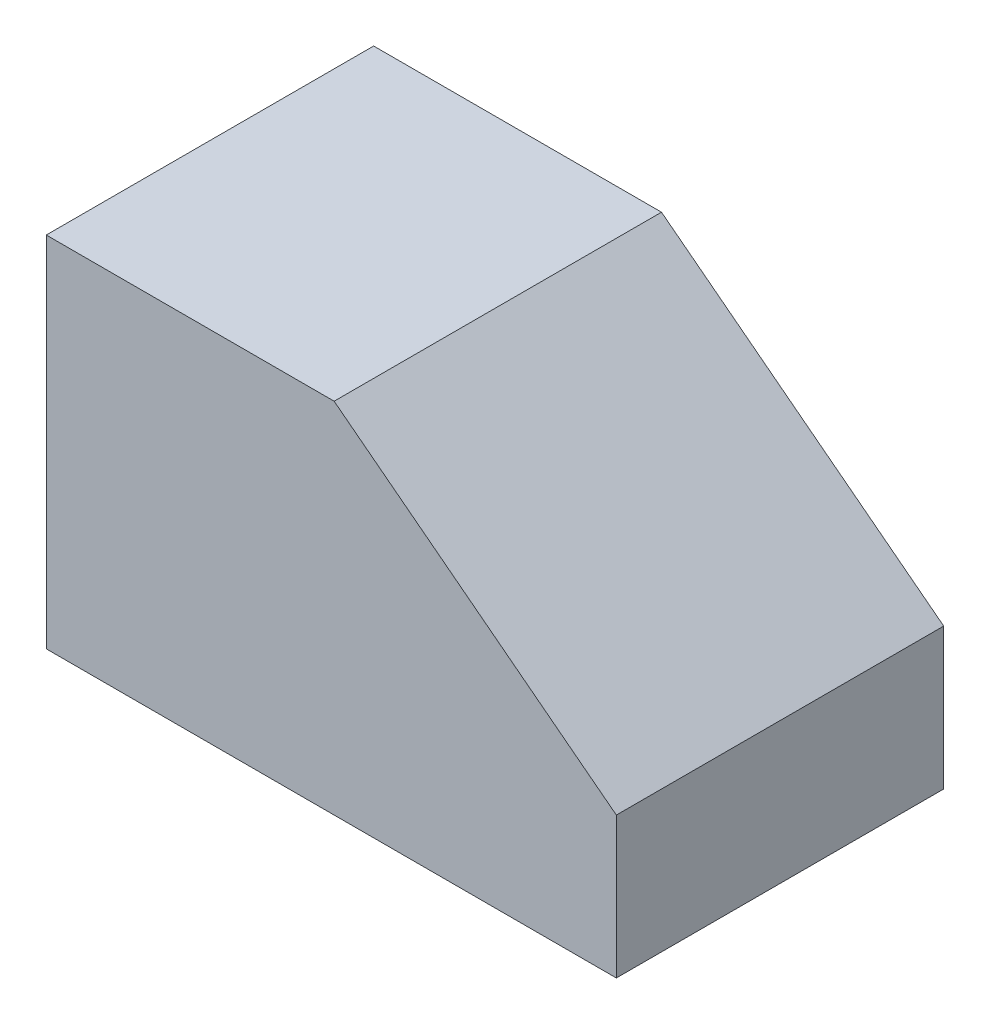
ISO-10303-21;
HEADER;
FILE_DESCRIPTION(('STEP AP214'),'2;1');
FILE_NAME('part.step','',(''),(''),'','','');
FILE_SCHEMA(('AUTOMOTIVE_DESIGN { 1 0 10303 214 1 1 1 1 }'));
ENDSEC;
DATA;
#1=APPLICATION_CONTEXT('core data for automotive mechanical design processes');
#2=APPLICATION_PROTOCOL_DEFINITION('international standard','automotive_design',2000,#1);
#3=PRODUCT_CONTEXT('',#1,'mechanical');
#4=PRODUCT('Part','Part','',(#3));
#5=PRODUCT_RELATED_PRODUCT_CATEGORY('part','',(#4));
#6=PRODUCT_DEFINITION_FORMATION('','',#4);
#7=PRODUCT_DEFINITION_CONTEXT('part definition',#1,'design');
#8=PRODUCT_DEFINITION('design','',#6,#7);
#9=PRODUCT_DEFINITION_SHAPE('','',#8);
#10=(LENGTH_UNIT() NAMED_UNIT(*) SI_UNIT(.MILLI.,.METRE.));
#11=(NAMED_UNIT(*) PLANE_ANGLE_UNIT() SI_UNIT($,.RADIAN.));
#12=(NAMED_UNIT(*) SI_UNIT($,.STERADIAN.) SOLID_ANGLE_UNIT());
#13=UNCERTAINTY_MEASURE_WITH_UNIT(LENGTH_MEASURE(1.E-05),#10,'distance_accuracy_value','');
#14=(GEOMETRIC_REPRESENTATION_CONTEXT(3) GLOBAL_UNCERTAINTY_ASSIGNED_CONTEXT((#13)) GLOBAL_UNIT_ASSIGNED_CONTEXT((#10,
#11,#12)) REPRESENTATION_CONTEXT('',''));
#15=CARTESIAN_POINT('',(0.,0.,0.));
#16=DIRECTION('',(0.,0.,1.));
#17=DIRECTION('',(1.,0.,0.));
#18=AXIS2_PLACEMENT_3D('',#15,#16,#17);
#19=CARTESIAN_POINT('',(0.,63.5,29.));
#20=DIRECTION('',(1.,0.,0.));
#21=DIRECTION('',(0.,1.,0.));
#22=AXIS2_PLACEMENT_3D('',#19,#20,#21);
#23=PLANE('',#22);
#24=DIRECTION('',(0.,-1.,0.));
#25=VECTOR('',#24,1.);
#26=CARTESIAN_POINT('',(0.,63.5,-29.));
#27=LINE('',#26,#25);
#28=CARTESIAN_POINT('',(0.,63.5,-29.));
#29=VERTEX_POINT('',#28);
#30=CARTESIAN_POINT('',(0.,0.,-29.));
#31=VERTEX_POINT('',#30);
#32=EDGE_CURVE('E106',#29,#31,#27,.T.);
#33=ORIENTED_EDGE('',*,*,#32,.T.);
#34=DIRECTION('',(0.,0.,-1.));
#35=VECTOR('',#34,1.);
#36=CARTESIAN_POINT('',(0.,0.,29.));
#37=LINE('',#36,#35);
#38=CARTESIAN_POINT('',(0.,0.,29.));
#39=VERTEX_POINT('',#38);
#40=EDGE_CURVE('E11',#39,#31,#37,.T.);
#41=ORIENTED_EDGE('',*,*,#40,.F.);
#42=DIRECTION('',(0.,-1.,0.));
#43=VECTOR('',#42,1.);
#44=CARTESIAN_POINT('',(0.,63.5,29.));
#45=LINE('',#44,#43);
#46=CARTESIAN_POINT('',(0.,63.5,29.));
#47=VERTEX_POINT('',#46);
#48=EDGE_CURVE('E114',#47,#39,#45,.T.);
#49=ORIENTED_EDGE('',*,*,#48,.F.);
#50=DIRECTION('',(0.,0.,-1.));
#51=VECTOR('',#50,1.);
#52=CARTESIAN_POINT('',(0.,63.5,29.));
#53=LINE('',#52,#51);
#54=EDGE_CURVE('E102',#47,#29,#53,.T.);
#55=ORIENTED_EDGE('',*,*,#54,.T.);
#56=EDGE_LOOP('',(#33,#41,#49,#55));
#57=FACE_BOUND('',#56,.T.);
#58=ADVANCED_FACE('F32',(#57),#23,.F.);
#59=CARTESIAN_POINT('',(0.,0.,29.));
#60=DIRECTION('',(0.,1.,0.));
#61=DIRECTION('',(0.,0.,1.));
#62=AXIS2_PLACEMENT_3D('',#59,#60,#61);
#63=PLANE('',#62);
#64=DIRECTION('',(1.,0.,0.));
#65=VECTOR('',#64,1.);
#66=CARTESIAN_POINT('',(0.,0.,-29.));
#67=LINE('',#66,#65);
#68=CARTESIAN_POINT('',(101.,0.,-29.));
#69=VERTEX_POINT('',#68);
#70=EDGE_CURVE('E109',#31,#69,#67,.T.);
#71=ORIENTED_EDGE('',*,*,#70,.T.);
#72=DIRECTION('',(0.,0.,-1.));
#73=VECTOR('',#72,1.);
#74=CARTESIAN_POINT('',(101.,0.,29.));
#75=LINE('',#74,#73);
#76=CARTESIAN_POINT('',(101.,0.,29.));
#77=VERTEX_POINT('',#76);
#78=EDGE_CURVE('E40',#77,#69,#75,.T.);
#79=ORIENTED_EDGE('',*,*,#78,.F.);
#80=DIRECTION('',(1.,0.,0.));
#81=VECTOR('',#80,1.);
#82=CARTESIAN_POINT('',(0.,0.,29.));
#83=LINE('',#82,#81);
#84=EDGE_CURVE('E82',#39,#77,#83,.T.);
#85=ORIENTED_EDGE('',*,*,#84,.F.);
#86=ORIENTED_EDGE('',*,*,#40,.T.);
#87=EDGE_LOOP('',(#71,#79,#85,#86));
#88=FACE_BOUND('',#87,.T.);
#89=ADVANCED_FACE('F133',(#88),#63,.F.);
#90=CARTESIAN_POINT('',(101.,0.,29.));
#91=DIRECTION('',(-1.,0.,0.));
#92=DIRECTION('',(0.,0.,1.));
#93=AXIS2_PLACEMENT_3D('',#90,#91,#92);
#94=PLANE('',#93);
#95=DIRECTION('',(0.,1.,0.));
#96=VECTOR('',#95,1.);
#97=CARTESIAN_POINT('',(101.,0.,-29.));
#98=LINE('',#97,#96);
#99=CARTESIAN_POINT('',(101.,25.,-29.));
#100=VERTEX_POINT('',#99);
#101=EDGE_CURVE('E97',#69,#100,#98,.T.);
#102=ORIENTED_EDGE('',*,*,#101,.T.);
#103=DIRECTION('',(0.,0.,-1.));
#104=VECTOR('',#103,1.);
#105=CARTESIAN_POINT('',(101.,25.,29.));
#106=LINE('',#105,#104);
#107=CARTESIAN_POINT('',(101.,25.,29.));
#108=VERTEX_POINT('',#107);
#109=EDGE_CURVE('E94',#108,#100,#106,.T.);
#110=ORIENTED_EDGE('',*,*,#109,.F.);
#111=DIRECTION('',(0.,1.,0.));
#112=VECTOR('',#111,1.);
#113=CARTESIAN_POINT('',(101.,0.,29.));
#114=LINE('',#113,#112);
#115=EDGE_CURVE('E86',#77,#108,#114,.T.);
#116=ORIENTED_EDGE('',*,*,#115,.F.);
#117=ORIENTED_EDGE('',*,*,#78,.T.);
#118=EDGE_LOOP('',(#102,#110,#116,#117));
#119=FACE_BOUND('',#118,.T.);
#120=ADVANCED_FACE('F95',(#119),#94,.F.);
#121=CARTESIAN_POINT('',(101.,25.,29.));
#122=DIRECTION('',(-0.610093599798248,-0.792329350387335,0.));
#123=DIRECTION('',(0.792329350387335,-0.610093599798248,0.));
#124=AXIS2_PLACEMENT_3D('',#121,#122,#123);
#125=PLANE('',#124);
#126=DIRECTION('',(-0.792329350387335,0.610093599798248,0.));
#127=VECTOR('',#126,1.);
#128=CARTESIAN_POINT('',(101.,25.,-29.));
#129=LINE('',#128,#127);
#130=CARTESIAN_POINT('',(51.,63.5,-29.));
#131=VERTEX_POINT('',#130);
#132=EDGE_CURVE('E68',#100,#131,#129,.T.);
#133=ORIENTED_EDGE('',*,*,#132,.T.);
#134=DIRECTION('',(0.,0.,-1.));
#135=VECTOR('',#134,1.);
#136=CARTESIAN_POINT('',(51.,63.5,29.));
#137=LINE('',#136,#135);
#138=CARTESIAN_POINT('',(51.,63.5,29.));
#139=VERTEX_POINT('',#138);
#140=EDGE_CURVE('E98',#139,#131,#137,.T.);
#141=ORIENTED_EDGE('',*,*,#140,.F.);
#142=DIRECTION('',(-0.792329350387335,0.610093599798248,0.));
#143=VECTOR('',#142,1.);
#144=CARTESIAN_POINT('',(101.,25.,29.));
#145=LINE('',#144,#143);
#146=EDGE_CURVE('E90',#108,#139,#145,.T.);
#147=ORIENTED_EDGE('',*,*,#146,.F.);
#148=ORIENTED_EDGE('',*,*,#109,.T.);
#149=EDGE_LOOP('',(#133,#141,#147,#148));
#150=FACE_BOUND('',#149,.T.);
#151=ADVANCED_FACE('F100',(#150),#125,.F.);
#152=CARTESIAN_POINT('',(51.,63.5,29.));
#153=DIRECTION('',(0.,-1.,0.));
#154=DIRECTION('',(1.,0.,0.));
#155=AXIS2_PLACEMENT_3D('',#152,#153,#154);
#156=PLANE('',#155);
#157=DIRECTION('',(-1.,0.,0.));
#158=VECTOR('',#157,1.);
#159=CARTESIAN_POINT('',(51.,63.5,-29.));
#160=LINE('',#159,#158);
#161=EDGE_CURVE('E74',#131,#29,#160,.T.);
#162=ORIENTED_EDGE('',*,*,#161,.T.);
#163=ORIENTED_EDGE('',*,*,#54,.F.);
#164=DIRECTION('',(-1.,0.,0.));
#165=VECTOR('',#164,1.);
#166=CARTESIAN_POINT('',(51.,63.5,29.));
#167=LINE('',#166,#165);
#168=EDGE_CURVE('E48',#139,#47,#167,.T.);
#169=ORIENTED_EDGE('',*,*,#168,.F.);
#170=ORIENTED_EDGE('',*,*,#140,.T.);
#171=EDGE_LOOP('',(#162,#163,#169,#170));
#172=FACE_BOUND('',#171,.T.);
#173=ADVANCED_FACE('F122',(#172),#156,.F.);
#174=CARTESIAN_POINT('',(0.,0.,29.));
#175=DIRECTION('',(0.,0.,1.));
#176=DIRECTION('',(1.,0.,0.));
#177=AXIS2_PLACEMENT_3D('',#174,#175,#176);
#178=PLANE('',#177);
#179=ORIENTED_EDGE('',*,*,#48,.T.);
#180=ORIENTED_EDGE('',*,*,#84,.T.);
#181=ORIENTED_EDGE('',*,*,#115,.T.);
#182=ORIENTED_EDGE('',*,*,#146,.T.);
#183=ORIENTED_EDGE('',*,*,#168,.T.);
#184=EDGE_LOOP('',(#179,#180,#181,#182,#183));
#185=FACE_BOUND('',#184,.T.);
#186=ADVANCED_FACE('F88',(#185),#178,.T.);
#187=CARTESIAN_POINT('',(0.,0.,-29.));
#188=DIRECTION('',(0.,0.,1.));
#189=DIRECTION('',(1.,0.,0.));
#190=AXIS2_PLACEMENT_3D('',#187,#188,#189);
#191=PLANE('',#190);
#192=ORIENTED_EDGE('',*,*,#32,.F.);
#193=ORIENTED_EDGE('',*,*,#161,.F.);
#194=ORIENTED_EDGE('',*,*,#132,.F.);
#195=ORIENTED_EDGE('',*,*,#101,.F.);
#196=ORIENTED_EDGE('',*,*,#70,.F.);
#197=EDGE_LOOP('',(#192,#193,#194,#195,#196));
#198=FACE_BOUND('',#197,.T.);
#199=ADVANCED_FACE('F118',(#198),#191,.F.);
#200=CLOSED_SHELL('',(#58,#89,#120,#151,#173,#186,#199));
#201=MANIFOLD_SOLID_BREP('B2',#200);
#202=ADVANCED_BREP_SHAPE_REPRESENTATION('',(#18,#201),#14);
#203=SHAPE_DEFINITION_REPRESENTATION(#9,#202);
ENDSEC;
END-ISO-10303-21;
